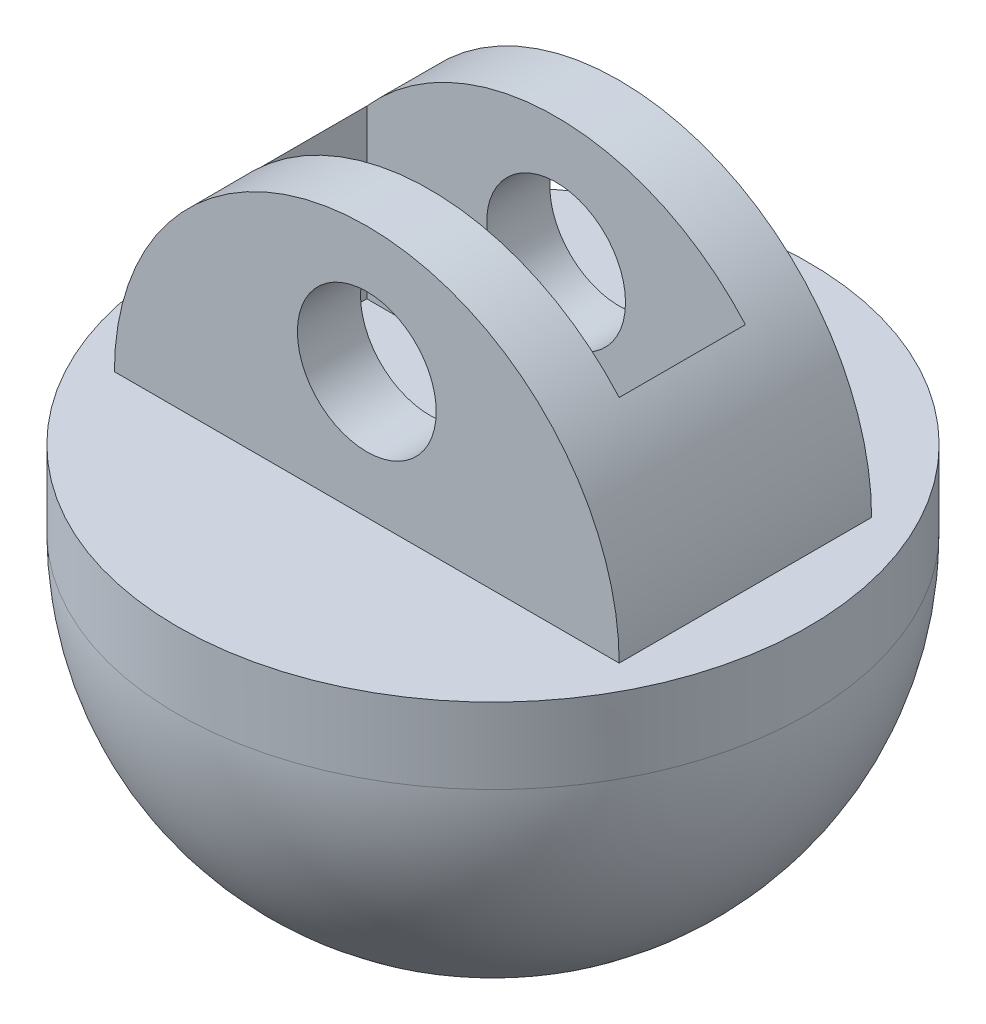
ISO-10303-21;
HEADER;
FILE_DESCRIPTION(('STEP AP214'),'2;1');
FILE_NAME('part.step','',(''),(''),'','','');
FILE_SCHEMA(('AUTOMOTIVE_DESIGN { 1 0 10303 214 1 1 1 1 }'));
ENDSEC;
DATA;
#1=APPLICATION_CONTEXT('core data for automotive mechanical design processes');
#2=APPLICATION_PROTOCOL_DEFINITION('international standard','automotive_design',2000,#1);
#3=PRODUCT_CONTEXT('',#1,'mechanical');
#4=PRODUCT('Part','Part','',(#3));
#5=PRODUCT_RELATED_PRODUCT_CATEGORY('part','',(#4));
#6=PRODUCT_DEFINITION_FORMATION('','',#4);
#7=PRODUCT_DEFINITION_CONTEXT('part definition',#1,'design');
#8=PRODUCT_DEFINITION('design','',#6,#7);
#9=PRODUCT_DEFINITION_SHAPE('','',#8);
#10=(LENGTH_UNIT() NAMED_UNIT(*) SI_UNIT(.MILLI.,.METRE.));
#11=(NAMED_UNIT(*) PLANE_ANGLE_UNIT() SI_UNIT($,.RADIAN.));
#12=(NAMED_UNIT(*) SI_UNIT($,.STERADIAN.) SOLID_ANGLE_UNIT());
#13=UNCERTAINTY_MEASURE_WITH_UNIT(LENGTH_MEASURE(1.E-05),#10,'distance_accuracy_value','');
#14=(GEOMETRIC_REPRESENTATION_CONTEXT(3) GLOBAL_UNCERTAINTY_ASSIGNED_CONTEXT((#13)) GLOBAL_UNIT_ASSIGNED_CONTEXT((#10,
#11,#12)) REPRESENTATION_CONTEXT('',''));
#15=CARTESIAN_POINT('',(0.,0.,0.));
#16=DIRECTION('',(0.,0.,1.));
#17=DIRECTION('',(1.,0.,0.));
#18=AXIS2_PLACEMENT_3D('',#15,#16,#17);
#19=CARTESIAN_POINT('',(7.105427357601E-12,6.,10.));
#20=DIRECTION('',(0.,0.,-1.));
#21=DIRECTION('',(-1.,0.,0.));
#22=AXIS2_PLACEMENT_3D('',#19,#20,#21);
#23=CYLINDRICAL_SURFACE('',#22,20.);
#24=CARTESIAN_POINT('',(7.105427357601E-12,6.,-10.));
#25=DIRECTION('',(0.,0.,1.));
#26=DIRECTION('',(1.,0.,0.));
#27=AXIS2_PLACEMENT_3D('',#24,#25,#26);
#28=CIRCLE('',#27,20.);
#29=CARTESIAN_POINT('',(20.0000000000071,6.,-10.));
#30=VERTEX_POINT('',#29);
#31=CARTESIAN_POINT('',(-19.9999999999929,6.,-10.));
#32=VERTEX_POINT('',#31);
#33=EDGE_CURVE('E49',#30,#32,#28,.T.);
#34=ORIENTED_EDGE('',*,*,#33,.T.);
#35=DIRECTION('',(0.,0.,-1.));
#36=VECTOR('',#35,1.);
#37=CARTESIAN_POINT('',(-19.9999999999929,6.,10.));
#38=LINE('',#37,#36);
#39=CARTESIAN_POINT('',(-19.9999999999929,6.,10.));
#40=VERTEX_POINT('',#39);
#41=EDGE_CURVE('E145',#40,#32,#38,.T.);
#42=ORIENTED_EDGE('',*,*,#41,.F.);
#43=CARTESIAN_POINT('',(7.105427357601E-12,6.,10.));
#44=DIRECTION('',(0.,0.,1.));
#45=DIRECTION('',(1.,0.,0.));
#46=AXIS2_PLACEMENT_3D('',#43,#44,#45);
#47=CIRCLE('',#46,20.);
#48=CARTESIAN_POINT('',(20.0000000000071,6.,10.));
#49=VERTEX_POINT('',#48);
#50=EDGE_CURVE('E137',#49,#40,#47,.T.);
#51=ORIENTED_EDGE('',*,*,#50,.F.);
#52=DIRECTION('',(0.,0.,-1.));
#53=VECTOR('',#52,1.);
#54=CARTESIAN_POINT('',(20.0000000000071,6.,10.));
#55=LINE('',#54,#53);
#56=EDGE_CURVE('E64',#49,#30,#55,.T.);
#57=ORIENTED_EDGE('',*,*,#56,.T.);
#58=EDGE_LOOP('',(#34,#42,#51,#57));
#59=FACE_BOUND('',#58,.T.);
#60=CARTESIAN_POINT('',(7.105427357601E-12,6.,-5.));
#61=DIRECTION('',(0.,0.,1.));
#62=DIRECTION('',(1.,0.,0.));
#63=AXIS2_PLACEMENT_3D('',#60,#61,#62);
#64=CIRCLE('',#63,20.);
#65=CARTESIAN_POINT('',(15.,19.228756555331,-5.));
#66=VERTEX_POINT('',#65);
#67=CARTESIAN_POINT('',(-15.,19.2287565553149,-5.));
#68=VERTEX_POINT('',#67);
#69=EDGE_CURVE('E126',#66,#68,#64,.T.);
#70=ORIENTED_EDGE('',*,*,#69,.F.);
#71=DIRECTION('',(0.,0.,-1.));
#72=VECTOR('',#71,1.);
#73=CARTESIAN_POINT('',(15.,19.228756555331,10.));
#74=LINE('',#73,#72);
#75=CARTESIAN_POINT('',(15.,19.228756555331,5.));
#76=VERTEX_POINT('',#75);
#77=EDGE_CURVE('E11',#76,#66,#74,.T.);
#78=ORIENTED_EDGE('',*,*,#77,.F.);
#79=CARTESIAN_POINT('',(7.105427357601E-12,6.,5.));
#80=DIRECTION('',(0.,0.,-1.));
#81=DIRECTION('',(-1.,0.,0.));
#82=AXIS2_PLACEMENT_3D('',#79,#80,#81);
#83=CIRCLE('',#82,20.);
#84=CARTESIAN_POINT('',(-15.,19.2287565553149,5.));
#85=VERTEX_POINT('',#84);
#86=EDGE_CURVE('E129',#85,#76,#83,.T.);
#87=ORIENTED_EDGE('',*,*,#86,.F.);
#88=DIRECTION('',(0.,0.,-1.));
#89=VECTOR('',#88,1.);
#90=CARTESIAN_POINT('',(-15.,19.2287565553149,10.));
#91=LINE('',#90,#89);
#92=EDGE_CURVE('E42',#68,#85,#91,.F.);
#93=ORIENTED_EDGE('',*,*,#92,.F.);
#94=EDGE_LOOP('',(#70,#78,#87,#93));
#95=FACE_BOUND('',#94,.T.);
#96=ADVANCED_FACE('F34',(#59,#95),#23,.T.);
#97=CARTESIAN_POINT('',(7.105427357601E-12,16.,10.));
#98=DIRECTION('',(0.,0.,-1.));
#99=DIRECTION('',(-1.,0.,0.));
#100=AXIS2_PLACEMENT_3D('',#97,#98,#99);
#101=CYLINDRICAL_SURFACE('',#100,5.5);
#102=CARTESIAN_POINT('',(7.105427357601E-12,16.,10.));
#103=DIRECTION('',(0.,0.,1.));
#104=DIRECTION('',(1.,0.,0.));
#105=AXIS2_PLACEMENT_3D('',#102,#103,#104);
#106=CIRCLE('',#105,5.5);
#107=CARTESIAN_POINT('',(5.50000000000711,16.,10.));
#108=VERTEX_POINT('',#107);
#109=EDGE_CURVE('E132',#108,#108,#106,.T.);
#110=ORIENTED_EDGE('',*,*,#109,.T.);
#111=EDGE_LOOP('',(#110));
#112=FACE_BOUND('',#111,.T.);
#113=CARTESIAN_POINT('',(7.105427357601E-12,16.,5.));
#114=DIRECTION('',(0.,0.,-1.));
#115=DIRECTION('',(-1.,0.,0.));
#116=AXIS2_PLACEMENT_3D('',#113,#114,#115);
#117=CIRCLE('',#116,5.5);
#118=CARTESIAN_POINT('',(-5.4999999999929,16.,5.));
#119=VERTEX_POINT('',#118);
#120=EDGE_CURVE('E128',#119,#119,#117,.T.);
#121=ORIENTED_EDGE('',*,*,#120,.T.);
#122=EDGE_LOOP('',(#121));
#123=FACE_BOUND('',#122,.T.);
#124=ADVANCED_FACE('F156',(#112,#123),#101,.F.);
#125=CARTESIAN_POINT('',(7.105427357601E-12,16.,-10.));
#126=DIRECTION('',(0.,0.,1.));
#127=DIRECTION('',(1.,0.,0.));
#128=AXIS2_PLACEMENT_3D('',#125,#126,#127);
#129=CIRCLE('',#128,5.5);
#130=CARTESIAN_POINT('',(5.50000000000711,16.,-10.));
#131=VERTEX_POINT('',#130);
#132=EDGE_CURVE('E131',#131,#131,#129,.T.);
#133=ORIENTED_EDGE('',*,*,#132,.F.);
#134=EDGE_LOOP('',(#133));
#135=FACE_BOUND('',#134,.T.);
#136=CARTESIAN_POINT('',(7.105427357601E-12,16.,-5.));
#137=DIRECTION('',(0.,0.,1.));
#138=DIRECTION('',(1.,0.,0.));
#139=AXIS2_PLACEMENT_3D('',#136,#137,#138);
#140=CIRCLE('',#139,5.5);
#141=CARTESIAN_POINT('',(5.50000000000711,16.,-5.));
#142=VERTEX_POINT('',#141);
#143=EDGE_CURVE('E98',#142,#142,#140,.T.);
#144=ORIENTED_EDGE('',*,*,#143,.T.);
#145=EDGE_LOOP('',(#144));
#146=FACE_BOUND('',#145,.T.);
#147=ADVANCED_FACE('F176',(#135,#146),#101,.F.);
#148=CARTESIAN_POINT('',(0.,6.,0.));
#149=DIRECTION('',(0.,1.,0.));
#150=DIRECTION('',(0.,0.,1.));
#151=AXIS2_PLACEMENT_3D('',#148,#149,#150);
#152=PLANE('',#151);
#153=CARTESIAN_POINT('',(0.,6.,0.));
#154=DIRECTION('',(0.,1.,0.));
#155=DIRECTION('',(0.,0.,1.));
#156=AXIS2_PLACEMENT_3D('',#153,#154,#155);
#157=CIRCLE('',#156,25.);
#158=CARTESIAN_POINT('',(0.,6.,25.));
#159=VERTEX_POINT('',#158);
#160=EDGE_CURVE('E148',#159,#159,#157,.T.);
#161=ORIENTED_EDGE('',*,*,#160,.T.);
#162=EDGE_LOOP('',(#161));
#163=FACE_BOUND('',#162,.T.);
#164=DIRECTION('',(1.,0.,0.));
#165=VECTOR('',#164,1.);
#166=CARTESIAN_POINT('',(20.0000000000071,6.,-10.));
#167=LINE('',#166,#165);
#168=EDGE_CURVE('E139',#32,#30,#167,.T.);
#169=ORIENTED_EDGE('',*,*,#168,.T.);
#170=ORIENTED_EDGE('',*,*,#56,.F.);
#171=DIRECTION('',(1.,0.,0.));
#172=VECTOR('',#171,1.);
#173=CARTESIAN_POINT('',(20.0000000000071,6.,10.));
#174=LINE('',#173,#172);
#175=EDGE_CURVE('E57',#40,#49,#174,.T.);
#176=ORIENTED_EDGE('',*,*,#175,.F.);
#177=ORIENTED_EDGE('',*,*,#41,.T.);
#178=EDGE_LOOP('',(#169,#170,#176,#177));
#179=FACE_BOUND('',#178,.T.);
#180=ADVANCED_FACE('F183',(#163,#179),#152,.T.);
#181=CARTESIAN_POINT('',(0.,6.,0.));
#182=DIRECTION('',(0.,-1.,0.));
#183=DIRECTION('',(0.,0.,-1.));
#184=AXIS2_PLACEMENT_3D('',#181,#182,#183);
#185=CYLINDRICAL_SURFACE('',#184,25.);
#186=ORIENTED_EDGE('',*,*,#160,.F.);
#187=EDGE_LOOP('',(#186));
#188=FACE_BOUND('',#187,.T.);
#189=CARTESIAN_POINT('',(0.,0.,0.));
#190=DIRECTION('',(0.,1.,0.));
#191=DIRECTION('',(-1.,0.,0.));
#192=AXIS2_PLACEMENT_3D('',#189,#190,#191);
#193=CIRCLE('',#192,25.);
#194=CARTESIAN_POINT('',(-25.,0.,0.));
#195=VERTEX_POINT('',#194);
#196=EDGE_CURVE('E114',#195,#195,#193,.T.);
#197=ORIENTED_EDGE('',*,*,#196,.T.);
#198=EDGE_LOOP('',(#197));
#199=FACE_BOUND('',#198,.T.);
#200=ADVANCED_FACE('F36',(#188,#199),#185,.T.);
#201=CARTESIAN_POINT('',(7.105427357601E-12,6.,10.));
#202=DIRECTION('',(0.,0.,1.));
#203=DIRECTION('',(1.,0.,0.));
#204=AXIS2_PLACEMENT_3D('',#201,#202,#203);
#205=PLANE('',#204);
#206=ORIENTED_EDGE('',*,*,#50,.T.);
#207=ORIENTED_EDGE('',*,*,#175,.T.);
#208=EDGE_LOOP('',(#206,#207));
#209=FACE_BOUND('',#208,.T.);
#210=ORIENTED_EDGE('',*,*,#109,.F.);
#211=EDGE_LOOP('',(#210));
#212=FACE_BOUND('',#211,.T.);
#213=ADVANCED_FACE('F190',(#209,#212),#205,.T.);
#214=CARTESIAN_POINT('',(7.105427357601E-12,6.,-10.));
#215=DIRECTION('',(0.,0.,1.));
#216=DIRECTION('',(1.,0.,0.));
#217=AXIS2_PLACEMENT_3D('',#214,#215,#216);
#218=PLANE('',#217);
#219=ORIENTED_EDGE('',*,*,#33,.F.);
#220=ORIENTED_EDGE('',*,*,#168,.F.);
#221=EDGE_LOOP('',(#219,#220));
#222=FACE_BOUND('',#221,.T.);
#223=ORIENTED_EDGE('',*,*,#132,.T.);
#224=EDGE_LOOP('',(#223));
#225=FACE_BOUND('',#224,.T.);
#226=ADVANCED_FACE('F181',(#222,#225),#218,.F.);
#227=CARTESIAN_POINT('',(-15.,26.,5.));
#228=DIRECTION('',(1.,0.,0.));
#229=DIRECTION('',(0.,0.,-1.));
#230=AXIS2_PLACEMENT_3D('',#227,#228,#229);
#231=PLANE('',#230);
#232=ORIENTED_EDGE('',*,*,#92,.T.);
#233=DIRECTION('',(0.,-1.,0.));
#234=VECTOR('',#233,1.);
#235=CARTESIAN_POINT('',(-15.,26.,5.));
#236=LINE('',#235,#234);
#237=CARTESIAN_POINT('',(-15.,6.,5.));
#238=VERTEX_POINT('',#237);
#239=EDGE_CURVE('E91',#85,#238,#236,.T.);
#240=ORIENTED_EDGE('',*,*,#239,.T.);
#241=DIRECTION('',(0.,0.,1.));
#242=VECTOR('',#241,1.);
#243=CARTESIAN_POINT('',(-15.,6.,5.));
#244=LINE('',#243,#242);
#245=CARTESIAN_POINT('',(-15.,6.,-5.));
#246=VERTEX_POINT('',#245);
#247=EDGE_CURVE('E95',#246,#238,#244,.T.);
#248=ORIENTED_EDGE('',*,*,#247,.F.);
#249=DIRECTION('',(0.,-1.,0.));
#250=VECTOR('',#249,1.);
#251=CARTESIAN_POINT('',(-15.,26.,-5.));
#252=LINE('',#251,#250);
#253=EDGE_CURVE('E121',#68,#246,#252,.T.);
#254=ORIENTED_EDGE('',*,*,#253,.F.);
#255=EDGE_LOOP('',(#232,#240,#248,#254));
#256=FACE_BOUND('',#255,.T.);
#257=ADVANCED_FACE('F93',(#256),#231,.T.);
#258=CARTESIAN_POINT('',(15.,26.,5.));
#259=DIRECTION('',(-1.,0.,0.));
#260=DIRECTION('',(0.,0.,1.));
#261=AXIS2_PLACEMENT_3D('',#258,#259,#260);
#262=PLANE('',#261);
#263=ORIENTED_EDGE('',*,*,#77,.T.);
#264=DIRECTION('',(0.,-1.,0.));
#265=VECTOR('',#264,1.);
#266=CARTESIAN_POINT('',(15.,26.,-5.));
#267=LINE('',#266,#265);
#268=CARTESIAN_POINT('',(15.,6.,-5.));
#269=VERTEX_POINT('',#268);
#270=EDGE_CURVE('E123',#66,#269,#267,.T.);
#271=ORIENTED_EDGE('',*,*,#270,.T.);
#272=DIRECTION('',(0.,0.,-1.));
#273=VECTOR('',#272,1.);
#274=CARTESIAN_POINT('',(15.,6.,5.));
#275=LINE('',#274,#273);
#276=CARTESIAN_POINT('',(15.,6.,5.));
#277=VERTEX_POINT('',#276);
#278=EDGE_CURVE('E108',#277,#269,#275,.T.);
#279=ORIENTED_EDGE('',*,*,#278,.F.);
#280=DIRECTION('',(0.,-1.,0.));
#281=VECTOR('',#280,1.);
#282=CARTESIAN_POINT('',(15.,26.,5.));
#283=LINE('',#282,#281);
#284=EDGE_CURVE('E99',#76,#277,#283,.T.);
#285=ORIENTED_EDGE('',*,*,#284,.F.);
#286=EDGE_LOOP('',(#263,#271,#279,#285));
#287=FACE_BOUND('',#286,.T.);
#288=ADVANCED_FACE('F160',(#287),#262,.T.);
#289=CARTESIAN_POINT('',(15.,26.,5.));
#290=DIRECTION('',(0.,0.,-1.));
#291=DIRECTION('',(-1.,0.,0.));
#292=AXIS2_PLACEMENT_3D('',#289,#290,#291);
#293=PLANE('',#292);
#294=ORIENTED_EDGE('',*,*,#120,.F.);
#295=EDGE_LOOP('',(#294));
#296=FACE_BOUND('',#295,.T.);
#297=ORIENTED_EDGE('',*,*,#86,.T.);
#298=ORIENTED_EDGE('',*,*,#284,.T.);
#299=DIRECTION('',(1.,0.,0.));
#300=VECTOR('',#299,1.);
#301=CARTESIAN_POINT('',(15.,6.,5.));
#302=LINE('',#301,#300);
#303=EDGE_CURVE('E102',#238,#277,#302,.T.);
#304=ORIENTED_EDGE('',*,*,#303,.F.);
#305=ORIENTED_EDGE('',*,*,#239,.F.);
#306=EDGE_LOOP('',(#297,#298,#304,#305));
#307=FACE_BOUND('',#306,.T.);
#308=ADVANCED_FACE('F103',(#296,#307),#293,.T.);
#309=CARTESIAN_POINT('',(15.,26.,-5.));
#310=DIRECTION('',(0.,0.,1.));
#311=DIRECTION('',(1.,0.,0.));
#312=AXIS2_PLACEMENT_3D('',#309,#310,#311);
#313=PLANE('',#312);
#314=ORIENTED_EDGE('',*,*,#143,.F.);
#315=EDGE_LOOP('',(#314));
#316=FACE_BOUND('',#315,.T.);
#317=ORIENTED_EDGE('',*,*,#69,.T.);
#318=ORIENTED_EDGE('',*,*,#253,.T.);
#319=DIRECTION('',(-1.,0.,0.));
#320=VECTOR('',#319,1.);
#321=CARTESIAN_POINT('',(15.,6.,-5.));
#322=LINE('',#321,#320);
#323=EDGE_CURVE('E113',#269,#246,#322,.T.);
#324=ORIENTED_EDGE('',*,*,#323,.F.);
#325=ORIENTED_EDGE('',*,*,#270,.F.);
#326=EDGE_LOOP('',(#317,#318,#324,#325));
#327=FACE_BOUND('',#326,.T.);
#328=ADVANCED_FACE('F159',(#316,#327),#313,.T.);
#329=CARTESIAN_POINT('',(0.,6.,0.));
#330=DIRECTION('',(0.,1.,0.));
#331=DIRECTION('',(0.,0.,1.));
#332=AXIS2_PLACEMENT_3D('',#329,#330,#331);
#333=PLANE('',#332);
#334=ORIENTED_EDGE('',*,*,#247,.T.);
#335=ORIENTED_EDGE('',*,*,#303,.T.);
#336=ORIENTED_EDGE('',*,*,#278,.T.);
#337=ORIENTED_EDGE('',*,*,#323,.T.);
#338=EDGE_LOOP('',(#334,#335,#336,#337));
#339=FACE_BOUND('',#338,.T.);
#340=ADVANCED_FACE('F111',(#339),#333,.T.);
#341=CARTESIAN_POINT('',(0.,0.,0.));
#342=DIRECTION('',(0.,1.,0.));
#343=DIRECTION('',(1.,0.,0.));
#344=AXIS2_PLACEMENT_3D('',#341,#342,#343);
#345=SPHERICAL_SURFACE('',#344,25.);
#346=ORIENTED_EDGE('',*,*,#196,.F.);
#347=EDGE_LOOP('',(#346));
#348=FACE_BOUND('',#347,.T.);
#349=ADVANCED_FACE('F270',(#348),#345,.T.);
#350=CLOSED_SHELL('',(#96,#124,#147,#180,#200,#213,#226,#257,#288,#308,#328,#340,#349));
#351=MANIFOLD_SOLID_BREP('B2',#350);
#352=ADVANCED_BREP_SHAPE_REPRESENTATION('',(#18,#351),#14);
#353=SHAPE_DEFINITION_REPRESENTATION(#9,#352);
ENDSEC;
END-ISO-10303-21;
